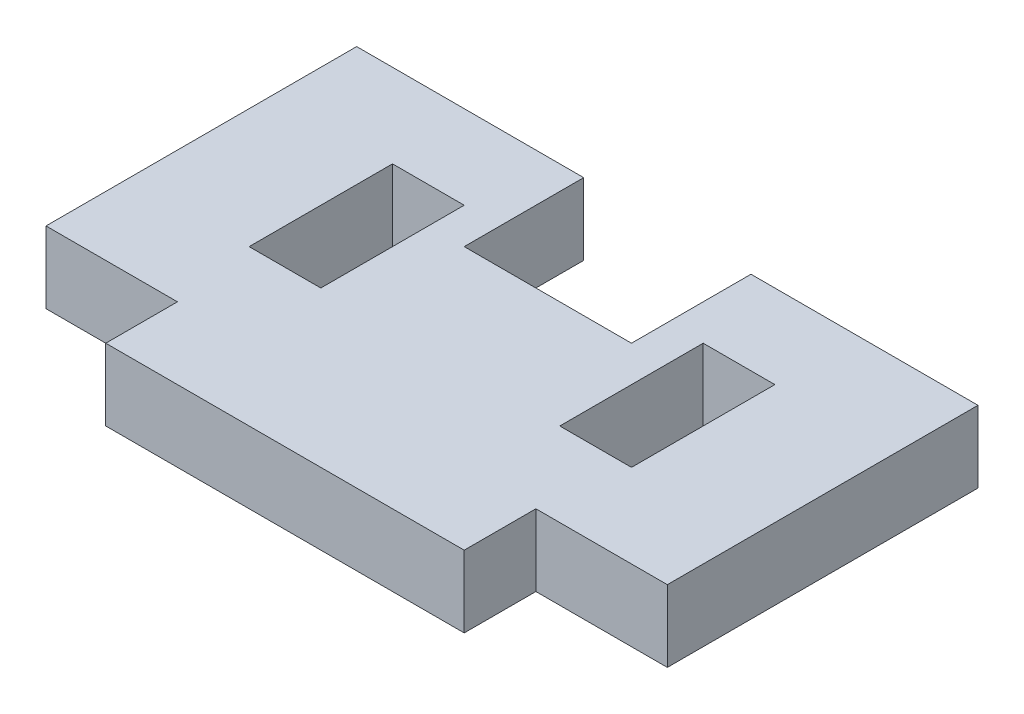
ISO-10303-21;
HEADER;
FILE_DESCRIPTION(('STEP AP214'),'2;1');
FILE_NAME('part.step','',(''),(''),'','','');
FILE_SCHEMA(('AUTOMOTIVE_DESIGN { 1 0 10303 214 1 1 1 1 }'));
ENDSEC;
DATA;
#1=APPLICATION_CONTEXT('core data for automotive mechanical design processes');
#2=APPLICATION_PROTOCOL_DEFINITION('international standard','automotive_design',2000,#1);
#3=PRODUCT_CONTEXT('',#1,'mechanical');
#4=PRODUCT('Part','Part','',(#3));
#5=PRODUCT_RELATED_PRODUCT_CATEGORY('part','',(#4));
#6=PRODUCT_DEFINITION_FORMATION('','',#4);
#7=PRODUCT_DEFINITION_CONTEXT('part definition',#1,'design');
#8=PRODUCT_DEFINITION('design','',#6,#7);
#9=PRODUCT_DEFINITION_SHAPE('','',#8);
#10=(LENGTH_UNIT() NAMED_UNIT(*) SI_UNIT(.MILLI.,.METRE.));
#11=(NAMED_UNIT(*) PLANE_ANGLE_UNIT() SI_UNIT($,.RADIAN.));
#12=(NAMED_UNIT(*) SI_UNIT($,.STERADIAN.) SOLID_ANGLE_UNIT());
#13=UNCERTAINTY_MEASURE_WITH_UNIT(LENGTH_MEASURE(1.E-05),#10,'distance_accuracy_value','');
#14=(GEOMETRIC_REPRESENTATION_CONTEXT(3) GLOBAL_UNCERTAINTY_ASSIGNED_CONTEXT((#13)) GLOBAL_UNIT_ASSIGNED_CONTEXT((#10,
#11,#12)) REPRESENTATION_CONTEXT('',''));
#15=CARTESIAN_POINT('',(0.,0.,0.));
#16=DIRECTION('',(0.,0.,1.));
#17=DIRECTION('',(1.,0.,0.));
#18=AXIS2_PLACEMENT_3D('',#15,#16,#17);
#19=CARTESIAN_POINT('',(0.,3.,0.));
#20=DIRECTION('',(0.,-1.,0.));
#21=DIRECTION('',(0.,0.,-1.));
#22=AXIS2_PLACEMENT_3D('',#19,#20,#21);
#23=PLANE('',#22);
#24=DIRECTION('',(0.,0.,1.));
#25=VECTOR('',#24,1.);
#26=CARTESIAN_POINT('',(-0.500000000000002,3.,-6.50000000000001));
#27=LINE('',#26,#25);
#28=CARTESIAN_POINT('',(-0.500000000000002,3.,-12.5));
#29=VERTEX_POINT('',#28);
#30=CARTESIAN_POINT('',(-0.500000000000002,3.,-6.50000000000001));
#31=VERTEX_POINT('',#30);
#32=EDGE_CURVE('E208',#29,#31,#27,.T.);
#33=ORIENTED_EDGE('',*,*,#32,.F.);
#34=DIRECTION('',(-1.,0.,0.));
#35=VECTOR('',#34,1.);
#36=CARTESIAN_POINT('',(-0.500000000000002,3.,-12.5));
#37=LINE('',#36,#35);
#38=CARTESIAN_POINT('',(2.5,3.,-12.5));
#39=VERTEX_POINT('',#38);
#40=EDGE_CURVE('E206',#39,#29,#37,.T.);
#41=ORIENTED_EDGE('',*,*,#40,.F.);
#42=DIRECTION('',(0.,0.,-1.));
#43=VECTOR('',#42,1.);
#44=CARTESIAN_POINT('',(2.5,3.,-12.5));
#45=LINE('',#44,#43);
#46=CARTESIAN_POINT('',(2.5,3.,-6.50000000000001));
#47=VERTEX_POINT('',#46);
#48=EDGE_CURVE('E213',#47,#39,#45,.T.);
#49=ORIENTED_EDGE('',*,*,#48,.F.);
#50=DIRECTION('',(1.,0.,0.));
#51=VECTOR('',#50,1.);
#52=CARTESIAN_POINT('',(2.5,3.,-6.50000000000001));
#53=LINE('',#52,#51);
#54=EDGE_CURVE('E211',#31,#47,#53,.T.);
#55=ORIENTED_EDGE('',*,*,#54,.F.);
#56=EDGE_LOOP('',(#33,#41,#49,#55));
#57=FACE_BOUND('',#56,.T.);
#58=DIRECTION('',(0.,0.,1.));
#59=VECTOR('',#58,1.);
#60=CARTESIAN_POINT('',(0.,3.,0.));
#61=LINE('',#60,#59);
#62=CARTESIAN_POINT('',(0.,3.,-3.00000000000001));
#63=VERTEX_POINT('',#62);
#64=CARTESIAN_POINT('',(0.,3.,0.));
#65=VERTEX_POINT('',#64);
#66=EDGE_CURVE('E235',#63,#65,#61,.T.);
#67=ORIENTED_EDGE('',*,*,#66,.T.);
#68=DIRECTION('',(1.,0.,0.));
#69=VECTOR('',#68,1.);
#70=CARTESIAN_POINT('',(0.,3.,0.));
#71=LINE('',#70,#69);
#72=CARTESIAN_POINT('',(15.,3.,0.));
#73=VERTEX_POINT('',#72);
#74=EDGE_CURVE('E238',#65,#73,#71,.T.);
#75=ORIENTED_EDGE('',*,*,#74,.T.);
#76=DIRECTION('',(0.,0.,-1.));
#77=VECTOR('',#76,1.);
#78=CARTESIAN_POINT('',(15.,3.,0.));
#79=LINE('',#78,#77);
#80=CARTESIAN_POINT('',(15.,3.,-3.));
#81=VERTEX_POINT('',#80);
#82=EDGE_CURVE('E241',#73,#81,#79,.T.);
#83=ORIENTED_EDGE('',*,*,#82,.T.);
#84=DIRECTION('',(1.,0.,0.));
#85=VECTOR('',#84,1.);
#86=CARTESIAN_POINT('',(15.,3.,-3.));
#87=LINE('',#86,#85);
#88=CARTESIAN_POINT('',(20.5,3.,-3.));
#89=VERTEX_POINT('',#88);
#90=EDGE_CURVE('E243',#81,#89,#87,.T.);
#91=ORIENTED_EDGE('',*,*,#90,.T.);
#92=DIRECTION('',(0.,0.,-1.));
#93=VECTOR('',#92,1.);
#94=CARTESIAN_POINT('',(20.5,3.,-3.));
#95=LINE('',#94,#93);
#96=CARTESIAN_POINT('',(20.5,3.,-16.));
#97=VERTEX_POINT('',#96);
#98=EDGE_CURVE('E245',#89,#97,#95,.T.);
#99=ORIENTED_EDGE('',*,*,#98,.T.);
#100=DIRECTION('',(-1.,0.,0.));
#101=VECTOR('',#100,1.);
#102=CARTESIAN_POINT('',(20.5,3.,-16.));
#103=LINE('',#102,#101);
#104=CARTESIAN_POINT('',(11.,3.,-16.));
#105=VERTEX_POINT('',#104);
#106=EDGE_CURVE('E247',#97,#105,#103,.T.);
#107=ORIENTED_EDGE('',*,*,#106,.T.);
#108=DIRECTION('',(0.,0.,1.));
#109=VECTOR('',#108,1.);
#110=CARTESIAN_POINT('',(11.,3.,-11.));
#111=LINE('',#110,#109);
#112=CARTESIAN_POINT('',(11.,3.,-11.));
#113=VERTEX_POINT('',#112);
#114=EDGE_CURVE('E249',#105,#113,#111,.T.);
#115=ORIENTED_EDGE('',*,*,#114,.T.);
#116=DIRECTION('',(-1.,0.,0.));
#117=VECTOR('',#116,1.);
#118=CARTESIAN_POINT('',(7.5,3.,-11.));
#119=LINE('',#118,#117);
#120=CARTESIAN_POINT('',(4.,3.,-11.));
#121=VERTEX_POINT('',#120);
#122=EDGE_CURVE('E251',#113,#121,#119,.T.);
#123=ORIENTED_EDGE('',*,*,#122,.T.);
#124=DIRECTION('',(0.,0.,-1.));
#125=VECTOR('',#124,1.);
#126=CARTESIAN_POINT('',(4.,3.,-11.));
#127=LINE('',#126,#125);
#128=CARTESIAN_POINT('',(4.,3.,-16.));
#129=VERTEX_POINT('',#128);
#130=EDGE_CURVE('E253',#121,#129,#127,.T.);
#131=ORIENTED_EDGE('',*,*,#130,.T.);
#132=DIRECTION('',(-1.,0.,0.));
#133=VECTOR('',#132,1.);
#134=CARTESIAN_POINT('',(4.,3.,-16.));
#135=LINE('',#134,#133);
#136=CARTESIAN_POINT('',(-5.49999999999999,3.,-16.));
#137=VERTEX_POINT('',#136);
#138=EDGE_CURVE('E255',#129,#137,#135,.T.);
#139=ORIENTED_EDGE('',*,*,#138,.T.);
#140=DIRECTION('',(0.,0.,1.));
#141=VECTOR('',#140,1.);
#142=CARTESIAN_POINT('',(-5.5,3.,-3.00000000000001));
#143=LINE('',#142,#141);
#144=CARTESIAN_POINT('',(-5.5,3.,-3.00000000000001));
#145=VERTEX_POINT('',#144);
#146=EDGE_CURVE('E257',#137,#145,#143,.T.);
#147=ORIENTED_EDGE('',*,*,#146,.T.);
#148=DIRECTION('',(1.,0.,0.));
#149=VECTOR('',#148,1.);
#150=CARTESIAN_POINT('',(-5.5,3.,-3.00000000000001));
#151=LINE('',#150,#149);
#152=EDGE_CURVE('E259',#145,#63,#151,.T.);
#153=ORIENTED_EDGE('',*,*,#152,.T.);
#154=EDGE_LOOP('',(#67,#75,#83,#91,#99,#107,#115,#123,#131,#139,#147,#153));
#155=FACE_BOUND('',#154,.T.);
#156=DIRECTION('',(0.,0.,1.));
#157=VECTOR('',#156,1.);
#158=CARTESIAN_POINT('',(12.5,3.,-12.5));
#159=LINE('',#158,#157);
#160=CARTESIAN_POINT('',(12.5,3.,-12.5));
#161=VERTEX_POINT('',#160);
#162=CARTESIAN_POINT('',(12.5,3.,-6.50000000000001));
#163=VERTEX_POINT('',#162);
#164=EDGE_CURVE('E170',#161,#163,#159,.T.);
#165=ORIENTED_EDGE('',*,*,#164,.F.);
#166=DIRECTION('',(-1.,0.,0.));
#167=VECTOR('',#166,1.);
#168=CARTESIAN_POINT('',(15.5,3.,-12.5));
#169=LINE('',#168,#167);
#170=CARTESIAN_POINT('',(15.5,3.,-12.5));
#171=VERTEX_POINT('',#170);
#172=EDGE_CURVE('E192',#171,#161,#169,.T.);
#173=ORIENTED_EDGE('',*,*,#172,.F.);
#174=DIRECTION('',(0.,0.,-1.));
#175=VECTOR('',#174,1.);
#176=CARTESIAN_POINT('',(15.5,3.,-6.50000000000001));
#177=LINE('',#176,#175);
#178=CARTESIAN_POINT('',(15.5,3.,-6.50000000000001));
#179=VERTEX_POINT('',#178);
#180=EDGE_CURVE('E190',#179,#171,#177,.T.);
#181=ORIENTED_EDGE('',*,*,#180,.F.);
#182=DIRECTION('',(1.,0.,0.));
#183=VECTOR('',#182,1.);
#184=CARTESIAN_POINT('',(12.5,3.,-6.50000000000001));
#185=LINE('',#184,#183);
#186=EDGE_CURVE('E178',#163,#179,#185,.T.);
#187=ORIENTED_EDGE('',*,*,#186,.F.);
#188=EDGE_LOOP('',(#165,#173,#181,#187));
#189=FACE_BOUND('',#188,.T.);
#190=ADVANCED_FACE('F33',(#57,#155,#189),#23,.F.);
#191=CARTESIAN_POINT('',(0.,0.,0.));
#192=DIRECTION('',(0.,-1.,0.));
#193=DIRECTION('',(0.,0.,-1.));
#194=AXIS2_PLACEMENT_3D('',#191,#192,#193);
#195=PLANE('',#194);
#196=DIRECTION('',(0.,0.,1.));
#197=VECTOR('',#196,1.);
#198=CARTESIAN_POINT('',(0.,0.,0.));
#199=LINE('',#198,#197);
#200=CARTESIAN_POINT('',(0.,0.,-3.00000000000001));
#201=VERTEX_POINT('',#200);
#202=CARTESIAN_POINT('',(0.,0.,0.));
#203=VERTEX_POINT('',#202);
#204=EDGE_CURVE('E234',#201,#203,#199,.T.);
#205=ORIENTED_EDGE('',*,*,#204,.F.);
#206=DIRECTION('',(1.,0.,0.));
#207=VECTOR('',#206,1.);
#208=CARTESIAN_POINT('',(-5.5,0.,-3.00000000000001));
#209=LINE('',#208,#207);
#210=CARTESIAN_POINT('',(-5.5,0.,-3.00000000000001));
#211=VERTEX_POINT('',#210);
#212=EDGE_CURVE('E239',#211,#201,#209,.T.);
#213=ORIENTED_EDGE('',*,*,#212,.F.);
#214=DIRECTION('',(0.,0.,1.));
#215=VECTOR('',#214,1.);
#216=CARTESIAN_POINT('',(-5.5,0.,-3.00000000000001));
#217=LINE('',#216,#215);
#218=CARTESIAN_POINT('',(-5.49999999999999,0.,-16.));
#219=VERTEX_POINT('',#218);
#220=EDGE_CURVE('E283',#219,#211,#217,.T.);
#221=ORIENTED_EDGE('',*,*,#220,.F.);
#222=DIRECTION('',(-1.,0.,0.));
#223=VECTOR('',#222,1.);
#224=CARTESIAN_POINT('',(4.,0.,-16.));
#225=LINE('',#224,#223);
#226=CARTESIAN_POINT('',(4.,0.,-16.));
#227=VERTEX_POINT('',#226);
#228=EDGE_CURVE('E281',#227,#219,#225,.T.);
#229=ORIENTED_EDGE('',*,*,#228,.F.);
#230=DIRECTION('',(0.,0.,-1.));
#231=VECTOR('',#230,1.);
#232=CARTESIAN_POINT('',(4.,0.,-11.));
#233=LINE('',#232,#231);
#234=CARTESIAN_POINT('',(4.,0.,-11.));
#235=VERTEX_POINT('',#234);
#236=EDGE_CURVE('E279',#235,#227,#233,.T.);
#237=ORIENTED_EDGE('',*,*,#236,.F.);
#238=DIRECTION('',(-1.,0.,0.));
#239=VECTOR('',#238,1.);
#240=CARTESIAN_POINT('',(7.5,0.,-11.));
#241=LINE('',#240,#239);
#242=CARTESIAN_POINT('',(11.,0.,-11.));
#243=VERTEX_POINT('',#242);
#244=EDGE_CURVE('E277',#243,#235,#241,.T.);
#245=ORIENTED_EDGE('',*,*,#244,.F.);
#246=DIRECTION('',(0.,0.,1.));
#247=VECTOR('',#246,1.);
#248=CARTESIAN_POINT('',(11.,0.,-11.));
#249=LINE('',#248,#247);
#250=CARTESIAN_POINT('',(11.,0.,-16.));
#251=VERTEX_POINT('',#250);
#252=EDGE_CURVE('E274',#251,#243,#249,.T.);
#253=ORIENTED_EDGE('',*,*,#252,.F.);
#254=DIRECTION('',(-1.,0.,0.));
#255=VECTOR('',#254,1.);
#256=CARTESIAN_POINT('',(20.5,0.,-16.));
#257=LINE('',#256,#255);
#258=CARTESIAN_POINT('',(20.5,0.,-16.));
#259=VERTEX_POINT('',#258);
#260=EDGE_CURVE('E272',#259,#251,#257,.T.);
#261=ORIENTED_EDGE('',*,*,#260,.F.);
#262=DIRECTION('',(0.,0.,-1.));
#263=VECTOR('',#262,1.);
#264=CARTESIAN_POINT('',(20.5,0.,-3.));
#265=LINE('',#264,#263);
#266=CARTESIAN_POINT('',(20.5,0.,-3.));
#267=VERTEX_POINT('',#266);
#268=EDGE_CURVE('E270',#267,#259,#265,.T.);
#269=ORIENTED_EDGE('',*,*,#268,.F.);
#270=DIRECTION('',(1.,0.,0.));
#271=VECTOR('',#270,1.);
#272=CARTESIAN_POINT('',(15.,0.,-3.));
#273=LINE('',#272,#271);
#274=CARTESIAN_POINT('',(15.,0.,-3.));
#275=VERTEX_POINT('',#274);
#276=EDGE_CURVE('E268',#275,#267,#273,.T.);
#277=ORIENTED_EDGE('',*,*,#276,.F.);
#278=DIRECTION('',(0.,0.,-1.));
#279=VECTOR('',#278,1.);
#280=CARTESIAN_POINT('',(15.,0.,0.));
#281=LINE('',#280,#279);
#282=CARTESIAN_POINT('',(15.,0.,0.));
#283=VERTEX_POINT('',#282);
#284=EDGE_CURVE('E266',#283,#275,#281,.T.);
#285=ORIENTED_EDGE('',*,*,#284,.F.);
#286=DIRECTION('',(1.,0.,0.));
#287=VECTOR('',#286,1.);
#288=CARTESIAN_POINT('',(0.,0.,0.));
#289=LINE('',#288,#287);
#290=EDGE_CURVE('E264',#203,#283,#289,.T.);
#291=ORIENTED_EDGE('',*,*,#290,.F.);
#292=EDGE_LOOP('',(#205,#213,#221,#229,#237,#245,#253,#261,#269,#277,#285,#291));
#293=FACE_BOUND('',#292,.T.);
#294=DIRECTION('',(-1.,0.,0.));
#295=VECTOR('',#294,1.);
#296=CARTESIAN_POINT('',(0.999999999999998,0.,-12.5));
#297=LINE('',#296,#295);
#298=CARTESIAN_POINT('',(2.5,0.,-12.5));
#299=VERTEX_POINT('',#298);
#300=CARTESIAN_POINT('',(-0.500000000000002,0.,-12.5));
#301=VERTEX_POINT('',#300);
#302=EDGE_CURVE('E209',#299,#301,#297,.T.);
#303=ORIENTED_EDGE('',*,*,#302,.T.);
#304=DIRECTION('',(0.,0.,1.));
#305=VECTOR('',#304,1.);
#306=CARTESIAN_POINT('',(-0.500000000000002,0.,-6.50000000000001));
#307=LINE('',#306,#305);
#308=CARTESIAN_POINT('',(-0.500000000000002,0.,-6.50000000000001));
#309=VERTEX_POINT('',#308);
#310=EDGE_CURVE('E186',#301,#309,#307,.T.);
#311=ORIENTED_EDGE('',*,*,#310,.T.);
#312=DIRECTION('',(1.,0.,0.));
#313=VECTOR('',#312,1.);
#314=CARTESIAN_POINT('',(2.5,0.,-6.50000000000001));
#315=LINE('',#314,#313);
#316=CARTESIAN_POINT('',(2.5,0.,-6.50000000000001));
#317=VERTEX_POINT('',#316);
#318=EDGE_CURVE('E219',#309,#317,#315,.T.);
#319=ORIENTED_EDGE('',*,*,#318,.T.);
#320=DIRECTION('',(0.,0.,-1.));
#321=VECTOR('',#320,1.);
#322=CARTESIAN_POINT('',(2.5,0.,-12.5));
#323=LINE('',#322,#321);
#324=EDGE_CURVE('E222',#317,#299,#323,.T.);
#325=ORIENTED_EDGE('',*,*,#324,.T.);
#326=EDGE_LOOP('',(#303,#311,#319,#325));
#327=FACE_BOUND('',#326,.T.);
#328=DIRECTION('',(-1.,0.,0.));
#329=VECTOR('',#328,1.);
#330=CARTESIAN_POINT('',(14.,0.,-12.5));
#331=LINE('',#330,#329);
#332=CARTESIAN_POINT('',(15.5,0.,-12.5));
#333=VERTEX_POINT('',#332);
#334=CARTESIAN_POINT('',(12.5,0.,-12.5));
#335=VERTEX_POINT('',#334);
#336=EDGE_CURVE('E179',#333,#335,#331,.T.);
#337=ORIENTED_EDGE('',*,*,#336,.T.);
#338=DIRECTION('',(0.,0.,1.));
#339=VECTOR('',#338,1.);
#340=CARTESIAN_POINT('',(12.5,0.,-12.5));
#341=LINE('',#340,#339);
#342=CARTESIAN_POINT('',(12.5,0.,-6.50000000000001));
#343=VERTEX_POINT('',#342);
#344=EDGE_CURVE('E56',#335,#343,#341,.T.);
#345=ORIENTED_EDGE('',*,*,#344,.T.);
#346=DIRECTION('',(1.,0.,0.));
#347=VECTOR('',#346,1.);
#348=CARTESIAN_POINT('',(12.5,0.,-6.50000000000001));
#349=LINE('',#348,#347);
#350=CARTESIAN_POINT('',(15.5,0.,-6.50000000000001));
#351=VERTEX_POINT('',#350);
#352=EDGE_CURVE('E185',#343,#351,#349,.T.);
#353=ORIENTED_EDGE('',*,*,#352,.T.);
#354=DIRECTION('',(0.,0.,-1.));
#355=VECTOR('',#354,1.);
#356=CARTESIAN_POINT('',(15.5,0.,-6.50000000000001));
#357=LINE('',#356,#355);
#358=EDGE_CURVE('E198',#351,#333,#357,.T.);
#359=ORIENTED_EDGE('',*,*,#358,.T.);
#360=EDGE_LOOP('',(#337,#345,#353,#359));
#361=FACE_BOUND('',#360,.T.);
#362=ADVANCED_FACE('F325',(#293,#327,#361),#195,.T.);
#363=CARTESIAN_POINT('',(0.,3.,0.));
#364=DIRECTION('',(1.,0.,0.));
#365=DIRECTION('',(0.,0.,-1.));
#366=AXIS2_PLACEMENT_3D('',#363,#364,#365);
#367=PLANE('',#366);
#368=ORIENTED_EDGE('',*,*,#204,.T.);
#369=DIRECTION('',(0.,-1.,0.));
#370=VECTOR('',#369,1.);
#371=CARTESIAN_POINT('',(0.,3.,0.));
#372=LINE('',#371,#370);
#373=EDGE_CURVE('E11',#65,#203,#372,.T.);
#374=ORIENTED_EDGE('',*,*,#373,.F.);
#375=ORIENTED_EDGE('',*,*,#66,.F.);
#376=DIRECTION('',(0.,-1.,0.));
#377=VECTOR('',#376,1.);
#378=CARTESIAN_POINT('',(0.,3.,-3.00000000000001));
#379=LINE('',#378,#377);
#380=EDGE_CURVE('E261',#63,#201,#379,.T.);
#381=ORIENTED_EDGE('',*,*,#380,.T.);
#382=EDGE_LOOP('',(#368,#374,#375,#381));
#383=FACE_BOUND('',#382,.T.);
#384=ADVANCED_FACE('F35',(#383),#367,.F.);
#385=CARTESIAN_POINT('',(0.,3.,0.));
#386=DIRECTION('',(0.,0.,-1.));
#387=DIRECTION('',(-1.,0.,0.));
#388=AXIS2_PLACEMENT_3D('',#385,#386,#387);
#389=PLANE('',#388);
#390=ORIENTED_EDGE('',*,*,#290,.T.);
#391=DIRECTION('',(0.,-1.,0.));
#392=VECTOR('',#391,1.);
#393=CARTESIAN_POINT('',(15.,3.,0.));
#394=LINE('',#393,#392);
#395=EDGE_CURVE('E41',#73,#283,#394,.T.);
#396=ORIENTED_EDGE('',*,*,#395,.F.);
#397=ORIENTED_EDGE('',*,*,#74,.F.);
#398=ORIENTED_EDGE('',*,*,#373,.T.);
#399=EDGE_LOOP('',(#390,#396,#397,#398));
#400=FACE_BOUND('',#399,.T.);
#401=ADVANCED_FACE('F342',(#400),#389,.F.);
#402=CARTESIAN_POINT('',(15.,3.,0.));
#403=DIRECTION('',(-1.,0.,0.));
#404=DIRECTION('',(0.,0.,1.));
#405=AXIS2_PLACEMENT_3D('',#402,#403,#404);
#406=PLANE('',#405);
#407=ORIENTED_EDGE('',*,*,#284,.T.);
#408=DIRECTION('',(0.,-1.,0.));
#409=VECTOR('',#408,1.);
#410=CARTESIAN_POINT('',(15.,3.,-3.));
#411=LINE('',#410,#409);
#412=EDGE_CURVE('E312',#81,#275,#411,.T.);
#413=ORIENTED_EDGE('',*,*,#412,.F.);
#414=ORIENTED_EDGE('',*,*,#82,.F.);
#415=ORIENTED_EDGE('',*,*,#395,.T.);
#416=EDGE_LOOP('',(#407,#413,#414,#415));
#417=FACE_BOUND('',#416,.T.);
#418=ADVANCED_FACE('F319',(#417),#406,.F.);
#419=CARTESIAN_POINT('',(15.,3.,-3.));
#420=DIRECTION('',(0.,0.,-1.));
#421=DIRECTION('',(-1.,0.,0.));
#422=AXIS2_PLACEMENT_3D('',#419,#420,#421);
#423=PLANE('',#422);
#424=ORIENTED_EDGE('',*,*,#276,.T.);
#425=DIRECTION('',(0.,-1.,0.));
#426=VECTOR('',#425,1.);
#427=CARTESIAN_POINT('',(20.5,3.,-3.));
#428=LINE('',#427,#426);
#429=EDGE_CURVE('E309',#89,#267,#428,.T.);
#430=ORIENTED_EDGE('',*,*,#429,.F.);
#431=ORIENTED_EDGE('',*,*,#90,.F.);
#432=ORIENTED_EDGE('',*,*,#412,.T.);
#433=EDGE_LOOP('',(#424,#430,#431,#432));
#434=FACE_BOUND('',#433,.T.);
#435=ADVANCED_FACE('F331',(#434),#423,.F.);
#436=CARTESIAN_POINT('',(20.5,3.,-3.));
#437=DIRECTION('',(-1.,0.,0.));
#438=DIRECTION('',(0.,0.,1.));
#439=AXIS2_PLACEMENT_3D('',#436,#437,#438);
#440=PLANE('',#439);
#441=ORIENTED_EDGE('',*,*,#268,.T.);
#442=DIRECTION('',(0.,-1.,0.));
#443=VECTOR('',#442,1.);
#444=CARTESIAN_POINT('',(20.5,3.,-16.));
#445=LINE('',#444,#443);
#446=EDGE_CURVE('E306',#97,#259,#445,.T.);
#447=ORIENTED_EDGE('',*,*,#446,.F.);
#448=ORIENTED_EDGE('',*,*,#98,.F.);
#449=ORIENTED_EDGE('',*,*,#429,.T.);
#450=EDGE_LOOP('',(#441,#447,#448,#449));
#451=FACE_BOUND('',#450,.T.);
#452=ADVANCED_FACE('F335',(#451),#440,.F.);
#453=CARTESIAN_POINT('',(20.5,3.,-16.));
#454=DIRECTION('',(0.,0.,1.));
#455=DIRECTION('',(1.,0.,0.));
#456=AXIS2_PLACEMENT_3D('',#453,#454,#455);
#457=PLANE('',#456);
#458=ORIENTED_EDGE('',*,*,#260,.T.);
#459=DIRECTION('',(0.,-1.,0.));
#460=VECTOR('',#459,1.);
#461=CARTESIAN_POINT('',(11.,3.,-16.));
#462=LINE('',#461,#460);
#463=EDGE_CURVE('E303',#105,#251,#462,.T.);
#464=ORIENTED_EDGE('',*,*,#463,.F.);
#465=ORIENTED_EDGE('',*,*,#106,.F.);
#466=ORIENTED_EDGE('',*,*,#446,.T.);
#467=EDGE_LOOP('',(#458,#464,#465,#466));
#468=FACE_BOUND('',#467,.T.);
#469=ADVANCED_FACE('F374',(#468),#457,.F.);
#470=CARTESIAN_POINT('',(11.,3.,-11.));
#471=DIRECTION('',(1.,0.,0.));
#472=DIRECTION('',(0.,0.,-1.));
#473=AXIS2_PLACEMENT_3D('',#470,#471,#472);
#474=PLANE('',#473);
#475=ORIENTED_EDGE('',*,*,#252,.T.);
#476=DIRECTION('',(0.,-1.,0.));
#477=VECTOR('',#476,1.);
#478=CARTESIAN_POINT('',(11.,3.,-11.));
#479=LINE('',#478,#477);
#480=EDGE_CURVE('E300',#113,#243,#479,.T.);
#481=ORIENTED_EDGE('',*,*,#480,.F.);
#482=ORIENTED_EDGE('',*,*,#114,.F.);
#483=ORIENTED_EDGE('',*,*,#463,.T.);
#484=EDGE_LOOP('',(#475,#481,#482,#483));
#485=FACE_BOUND('',#484,.T.);
#486=ADVANCED_FACE('F372',(#485),#474,.F.);
#487=CARTESIAN_POINT('',(7.5,3.,-11.));
#488=DIRECTION('',(0.,0.,1.));
#489=DIRECTION('',(1.,0.,0.));
#490=AXIS2_PLACEMENT_3D('',#487,#488,#489);
#491=PLANE('',#490);
#492=ORIENTED_EDGE('',*,*,#244,.T.);
#493=DIRECTION('',(0.,-1.,0.));
#494=VECTOR('',#493,1.);
#495=CARTESIAN_POINT('',(4.,3.,-11.));
#496=LINE('',#495,#494);
#497=EDGE_CURVE('E297',#121,#235,#496,.T.);
#498=ORIENTED_EDGE('',*,*,#497,.F.);
#499=ORIENTED_EDGE('',*,*,#122,.F.);
#500=ORIENTED_EDGE('',*,*,#480,.T.);
#501=EDGE_LOOP('',(#492,#498,#499,#500));
#502=FACE_BOUND('',#501,.T.);
#503=ADVANCED_FACE('F368',(#502),#491,.F.);
#504=CARTESIAN_POINT('',(4.,3.,-11.));
#505=DIRECTION('',(-1.,0.,0.));
#506=DIRECTION('',(0.,0.,1.));
#507=AXIS2_PLACEMENT_3D('',#504,#505,#506);
#508=PLANE('',#507);
#509=ORIENTED_EDGE('',*,*,#236,.T.);
#510=DIRECTION('',(0.,-1.,0.));
#511=VECTOR('',#510,1.);
#512=CARTESIAN_POINT('',(4.,3.,-16.));
#513=LINE('',#512,#511);
#514=EDGE_CURVE('E294',#129,#227,#513,.T.);
#515=ORIENTED_EDGE('',*,*,#514,.F.);
#516=ORIENTED_EDGE('',*,*,#130,.F.);
#517=ORIENTED_EDGE('',*,*,#497,.T.);
#518=EDGE_LOOP('',(#509,#515,#516,#517));
#519=FACE_BOUND('',#518,.T.);
#520=ADVANCED_FACE('F363',(#519),#508,.F.);
#521=CARTESIAN_POINT('',(4.,3.,-16.));
#522=DIRECTION('',(0.,0.,1.));
#523=DIRECTION('',(1.,0.,0.));
#524=AXIS2_PLACEMENT_3D('',#521,#522,#523);
#525=PLANE('',#524);
#526=ORIENTED_EDGE('',*,*,#228,.T.);
#527=DIRECTION('',(0.,-1.,0.));
#528=VECTOR('',#527,1.);
#529=CARTESIAN_POINT('',(-5.49999999999999,3.,-16.));
#530=LINE('',#529,#528);
#531=EDGE_CURVE('E291',#137,#219,#530,.T.);
#532=ORIENTED_EDGE('',*,*,#531,.F.);
#533=ORIENTED_EDGE('',*,*,#138,.F.);
#534=ORIENTED_EDGE('',*,*,#514,.T.);
#535=EDGE_LOOP('',(#526,#532,#533,#534));
#536=FACE_BOUND('',#535,.T.);
#537=ADVANCED_FACE('F358',(#536),#525,.F.);
#538=CARTESIAN_POINT('',(-5.5,3.,-3.00000000000001));
#539=DIRECTION('',(1.,0.,0.));
#540=DIRECTION('',(0.,0.,-1.));
#541=AXIS2_PLACEMENT_3D('',#538,#539,#540);
#542=PLANE('',#541);
#543=ORIENTED_EDGE('',*,*,#220,.T.);
#544=DIRECTION('',(0.,-1.,0.));
#545=VECTOR('',#544,1.);
#546=CARTESIAN_POINT('',(-5.5,3.,-3.00000000000001));
#547=LINE('',#546,#545);
#548=EDGE_CURVE('E288',#145,#211,#547,.T.);
#549=ORIENTED_EDGE('',*,*,#548,.F.);
#550=ORIENTED_EDGE('',*,*,#146,.F.);
#551=ORIENTED_EDGE('',*,*,#531,.T.);
#552=EDGE_LOOP('',(#543,#549,#550,#551));
#553=FACE_BOUND('',#552,.T.);
#554=ADVANCED_FACE('F354',(#553),#542,.F.);
#555=CARTESIAN_POINT('',(-5.5,3.,-3.00000000000001));
#556=DIRECTION('',(0.,0.,-1.));
#557=DIRECTION('',(-1.,0.,0.));
#558=AXIS2_PLACEMENT_3D('',#555,#556,#557);
#559=PLANE('',#558);
#560=ORIENTED_EDGE('',*,*,#212,.T.);
#561=ORIENTED_EDGE('',*,*,#380,.F.);
#562=ORIENTED_EDGE('',*,*,#152,.F.);
#563=ORIENTED_EDGE('',*,*,#548,.T.);
#564=EDGE_LOOP('',(#560,#561,#562,#563));
#565=FACE_BOUND('',#564,.T.);
#566=ADVANCED_FACE('F349',(#565),#559,.F.);
#567=CARTESIAN_POINT('',(-0.500000000000002,3.,-6.50000000000001));
#568=DIRECTION('',(1.,0.,0.));
#569=DIRECTION('',(0.,0.,-1.));
#570=AXIS2_PLACEMENT_3D('',#567,#568,#569);
#571=PLANE('',#570);
#572=ORIENTED_EDGE('',*,*,#310,.F.);
#573=DIRECTION('',(0.,-1.,0.));
#574=VECTOR('',#573,1.);
#575=CARTESIAN_POINT('',(-0.500000000000002,3.,-12.5));
#576=LINE('',#575,#574);
#577=EDGE_CURVE('E232',#29,#301,#576,.T.);
#578=ORIENTED_EDGE('',*,*,#577,.F.);
#579=ORIENTED_EDGE('',*,*,#32,.T.);
#580=DIRECTION('',(0.,-1.,0.));
#581=VECTOR('',#580,1.);
#582=CARTESIAN_POINT('',(-0.500000000000002,3.,-6.50000000000001));
#583=LINE('',#582,#581);
#584=EDGE_CURVE('E230',#31,#309,#583,.T.);
#585=ORIENTED_EDGE('',*,*,#584,.T.);
#586=EDGE_LOOP('',(#572,#578,#579,#585));
#587=FACE_BOUND('',#586,.T.);
#588=ADVANCED_FACE('F392',(#587),#571,.T.);
#589=CARTESIAN_POINT('',(2.5,3.,-6.50000000000001));
#590=DIRECTION('',(0.,0.,-1.));
#591=DIRECTION('',(-1.,0.,0.));
#592=AXIS2_PLACEMENT_3D('',#589,#590,#591);
#593=PLANE('',#592);
#594=ORIENTED_EDGE('',*,*,#318,.F.);
#595=ORIENTED_EDGE('',*,*,#584,.F.);
#596=ORIENTED_EDGE('',*,*,#54,.T.);
#597=DIRECTION('',(0.,-1.,0.));
#598=VECTOR('',#597,1.);
#599=CARTESIAN_POINT('',(2.5,3.,-6.50000000000001));
#600=LINE('',#599,#598);
#601=EDGE_CURVE('E228',#47,#317,#600,.T.);
#602=ORIENTED_EDGE('',*,*,#601,.T.);
#603=EDGE_LOOP('',(#594,#595,#596,#602));
#604=FACE_BOUND('',#603,.T.);
#605=ADVANCED_FACE('F430',(#604),#593,.T.);
#606=CARTESIAN_POINT('',(2.5,3.,-12.5));
#607=DIRECTION('',(-1.,0.,0.));
#608=DIRECTION('',(0.,0.,1.));
#609=AXIS2_PLACEMENT_3D('',#606,#607,#608);
#610=PLANE('',#609);
#611=ORIENTED_EDGE('',*,*,#324,.F.);
#612=ORIENTED_EDGE('',*,*,#601,.F.);
#613=ORIENTED_EDGE('',*,*,#48,.T.);
#614=DIRECTION('',(0.,-1.,0.));
#615=VECTOR('',#614,1.);
#616=CARTESIAN_POINT('',(2.5,3.,-12.5));
#617=LINE('',#616,#615);
#618=EDGE_CURVE('E216',#39,#299,#617,.T.);
#619=ORIENTED_EDGE('',*,*,#618,.T.);
#620=EDGE_LOOP('',(#611,#612,#613,#619));
#621=FACE_BOUND('',#620,.T.);
#622=ADVANCED_FACE('F437',(#621),#610,.T.);
#623=CARTESIAN_POINT('',(0.999999999999998,3.,-12.5));
#624=DIRECTION('',(0.,0.,1.));
#625=DIRECTION('',(1.,0.,0.));
#626=AXIS2_PLACEMENT_3D('',#623,#624,#625);
#627=PLANE('',#626);
#628=ORIENTED_EDGE('',*,*,#302,.F.);
#629=ORIENTED_EDGE('',*,*,#618,.F.);
#630=ORIENTED_EDGE('',*,*,#40,.T.);
#631=ORIENTED_EDGE('',*,*,#577,.T.);
#632=EDGE_LOOP('',(#628,#629,#630,#631));
#633=FACE_BOUND('',#632,.T.);
#634=ADVANCED_FACE('F444',(#633),#627,.T.);
#635=CARTESIAN_POINT('',(12.5,3.,-12.5));
#636=DIRECTION('',(1.,0.,0.));
#637=DIRECTION('',(0.,0.,-1.));
#638=AXIS2_PLACEMENT_3D('',#635,#636,#637);
#639=PLANE('',#638);
#640=ORIENTED_EDGE('',*,*,#344,.F.);
#641=DIRECTION('',(0.,-1.,0.));
#642=VECTOR('',#641,1.);
#643=CARTESIAN_POINT('',(12.5,3.,-12.5));
#644=LINE('',#643,#642);
#645=EDGE_CURVE('E174',#161,#335,#644,.T.);
#646=ORIENTED_EDGE('',*,*,#645,.F.);
#647=ORIENTED_EDGE('',*,*,#164,.T.);
#648=DIRECTION('',(0.,-1.,0.));
#649=VECTOR('',#648,1.);
#650=CARTESIAN_POINT('',(12.5,3.,-6.50000000000001));
#651=LINE('',#650,#649);
#652=EDGE_CURVE('E173',#163,#343,#651,.T.);
#653=ORIENTED_EDGE('',*,*,#652,.T.);
#654=EDGE_LOOP('',(#640,#646,#647,#653));
#655=FACE_BOUND('',#654,.T.);
#656=ADVANCED_FACE('F172',(#655),#639,.T.);
#657=CARTESIAN_POINT('',(12.5,3.,-6.50000000000001));
#658=DIRECTION('',(0.,0.,-1.));
#659=DIRECTION('',(-1.,0.,0.));
#660=AXIS2_PLACEMENT_3D('',#657,#658,#659);
#661=PLANE('',#660);
#662=ORIENTED_EDGE('',*,*,#352,.F.);
#663=ORIENTED_EDGE('',*,*,#652,.F.);
#664=ORIENTED_EDGE('',*,*,#186,.T.);
#665=DIRECTION('',(0.,-1.,0.));
#666=VECTOR('',#665,1.);
#667=CARTESIAN_POINT('',(15.5,3.,-6.50000000000001));
#668=LINE('',#667,#666);
#669=EDGE_CURVE('E187',#179,#351,#668,.T.);
#670=ORIENTED_EDGE('',*,*,#669,.T.);
#671=EDGE_LOOP('',(#662,#663,#664,#670));
#672=FACE_BOUND('',#671,.T.);
#673=ADVANCED_FACE('F182',(#672),#661,.T.);
#674=CARTESIAN_POINT('',(15.5,3.,-6.50000000000001));
#675=DIRECTION('',(-1.,0.,0.));
#676=DIRECTION('',(0.,0.,1.));
#677=AXIS2_PLACEMENT_3D('',#674,#675,#676);
#678=PLANE('',#677);
#679=ORIENTED_EDGE('',*,*,#358,.F.);
#680=ORIENTED_EDGE('',*,*,#669,.F.);
#681=ORIENTED_EDGE('',*,*,#180,.T.);
#682=DIRECTION('',(0.,-1.,0.));
#683=VECTOR('',#682,1.);
#684=CARTESIAN_POINT('',(15.5,3.,-12.5));
#685=LINE('',#684,#683);
#686=EDGE_CURVE('E48',#171,#333,#685,.T.);
#687=ORIENTED_EDGE('',*,*,#686,.T.);
#688=EDGE_LOOP('',(#679,#680,#681,#687));
#689=FACE_BOUND('',#688,.T.);
#690=ADVANCED_FACE('F465',(#689),#678,.T.);
#691=CARTESIAN_POINT('',(14.,3.,-12.5));
#692=DIRECTION('',(0.,0.,1.));
#693=DIRECTION('',(1.,0.,0.));
#694=AXIS2_PLACEMENT_3D('',#691,#692,#693);
#695=PLANE('',#694);
#696=ORIENTED_EDGE('',*,*,#336,.F.);
#697=ORIENTED_EDGE('',*,*,#686,.F.);
#698=ORIENTED_EDGE('',*,*,#172,.T.);
#699=ORIENTED_EDGE('',*,*,#645,.T.);
#700=EDGE_LOOP('',(#696,#697,#698,#699));
#701=FACE_BOUND('',#700,.T.);
#702=ADVANCED_FACE('F472',(#701),#695,.T.);
#703=CLOSED_SHELL('',(#190,#362,#384,#401,#418,#435,#452,#469,#486,#503,#520,#537,#554,#566,
#588,#605,#622,#634,#656,#673,#690,#702));
#704=MANIFOLD_SOLID_BREP('B2',#703);
#705=ADVANCED_BREP_SHAPE_REPRESENTATION('',(#18,#704),#14);
#706=SHAPE_DEFINITION_REPRESENTATION(#9,#705);
ENDSEC;
END-ISO-10303-21;
